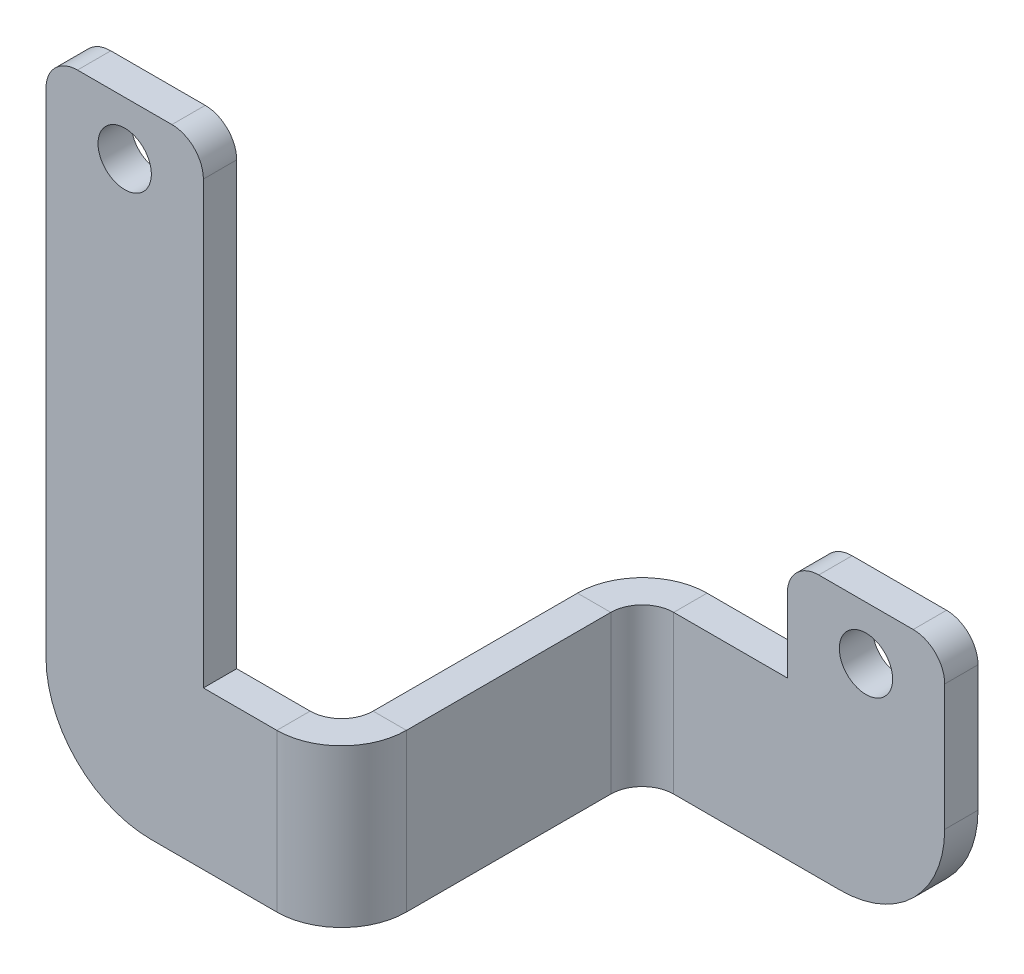
ISO-10303-21;
HEADER;
FILE_DESCRIPTION(('STEP AP214'),'2;1');
FILE_NAME('part.step','',(''),(''),'','','');
FILE_SCHEMA(('AUTOMOTIVE_DESIGN { 1 0 10303 214 1 1 1 1 }'));
ENDSEC;
DATA;
#1=APPLICATION_CONTEXT('core data for automotive mechanical design processes');
#2=APPLICATION_PROTOCOL_DEFINITION('international standard','automotive_design',2000,#1);
#3=PRODUCT_CONTEXT('',#1,'mechanical');
#4=PRODUCT('Part','Part','',(#3));
#5=PRODUCT_RELATED_PRODUCT_CATEGORY('part','',(#4));
#6=PRODUCT_DEFINITION_FORMATION('','',#4);
#7=PRODUCT_DEFINITION_CONTEXT('part definition',#1,'design');
#8=PRODUCT_DEFINITION('design','',#6,#7);
#9=PRODUCT_DEFINITION_SHAPE('','',#8);
#10=(LENGTH_UNIT() NAMED_UNIT(*) SI_UNIT(.MILLI.,.METRE.));
#11=(NAMED_UNIT(*) PLANE_ANGLE_UNIT() SI_UNIT($,.RADIAN.));
#12=(NAMED_UNIT(*) SI_UNIT($,.STERADIAN.) SOLID_ANGLE_UNIT());
#13=UNCERTAINTY_MEASURE_WITH_UNIT(LENGTH_MEASURE(1.E-05),#10,'distance_accuracy_value','');
#14=(GEOMETRIC_REPRESENTATION_CONTEXT(3) GLOBAL_UNCERTAINTY_ASSIGNED_CONTEXT((#13)) GLOBAL_UNIT_ASSIGNED_CONTEXT((#10,
#11,#12)) REPRESENTATION_CONTEXT('',''));
#15=CARTESIAN_POINT('',(0.,0.,0.));
#16=DIRECTION('',(0.,0.,1.));
#17=DIRECTION('',(1.,0.,0.));
#18=AXIS2_PLACEMENT_3D('',#15,#16,#17);
#19=CARTESIAN_POINT('',(15.6750000000001,7.5,-31.825));
#20=DIRECTION('',(0.,1.,0.));
#21=DIRECTION('',(0.,0.,1.));
#22=AXIS2_PLACEMENT_3D('',#19,#20,#21);
#23=PLANE('',#22);
#24=DIRECTION('',(-1.,0.,0.));
#25=VECTOR('',#24,1.);
#26=CARTESIAN_POINT('',(15.6750000000001,7.5,-28.65));
#27=LINE('',#26,#25);
#28=CARTESIAN_POINT('',(29.5000000000001,7.5,-28.65));
#29=VERTEX_POINT('',#28);
#30=CARTESIAN_POINT('',(18.6750000000001,7.5,-28.65));
#31=VERTEX_POINT('',#30);
#32=EDGE_CURVE('E208',#29,#31,#27,.T.);
#33=ORIENTED_EDGE('',*,*,#32,.F.);
#34=DIRECTION('',(0.,0.,1.));
#35=VECTOR('',#34,1.);
#36=CARTESIAN_POINT('',(29.5000000000001,7.5,-31.825));
#37=LINE('',#36,#35);
#38=CARTESIAN_POINT('',(29.5000000000001,7.5,-31.825));
#39=VERTEX_POINT('',#38);
#40=EDGE_CURVE('E194',#39,#29,#37,.T.);
#41=ORIENTED_EDGE('',*,*,#40,.F.);
#42=DIRECTION('',(-1.,0.,0.));
#43=VECTOR('',#42,1.);
#44=CARTESIAN_POINT('',(15.6750000000001,7.5,-31.825));
#45=LINE('',#44,#43);
#46=CARTESIAN_POINT('',(18.6750000000001,7.5,-31.825));
#47=VERTEX_POINT('',#46);
#48=EDGE_CURVE('E206',#39,#47,#45,.T.);
#49=ORIENTED_EDGE('',*,*,#48,.T.);
#50=DIRECTION('',(0.,0.,-1.));
#51=VECTOR('',#50,1.);
#52=CARTESIAN_POINT('',(18.6750000000001,7.5,-28.65));
#53=LINE('',#52,#51);
#54=EDGE_CURVE('E402',#31,#47,#53,.T.);
#55=ORIENTED_EDGE('',*,*,#54,.F.);
#56=EDGE_LOOP('',(#33,#41,#49,#55));
#57=FACE_BOUND('',#56,.T.);
#58=ADVANCED_FACE('F43',(#57),#23,.T.);
#59=CARTESIAN_POINT('',(-12.5,7.5,-3.175));
#60=DIRECTION('',(0.,1.,0.));
#61=DIRECTION('',(0.,0.,1.));
#62=AXIS2_PLACEMENT_3D('',#59,#60,#61);
#63=PLANE('',#62);
#64=DIRECTION('',(-1.,0.,0.));
#65=VECTOR('',#64,1.);
#66=CARTESIAN_POINT('',(-12.5,7.5,-3.175));
#67=LINE('',#66,#65);
#68=CARTESIAN_POINT('',(9.50000000000002,7.5,-3.175));
#69=VERTEX_POINT('',#68);
#70=CARTESIAN_POINT('',(2.5,7.5,-3.175));
#71=VERTEX_POINT('',#70);
#72=EDGE_CURVE('E297',#69,#71,#67,.T.);
#73=ORIENTED_EDGE('',*,*,#72,.T.);
#74=DIRECTION('',(0.,0.,-1.));
#75=VECTOR('',#74,1.);
#76=CARTESIAN_POINT('',(2.5,7.5,-3.175));
#77=LINE('',#76,#75);
#78=CARTESIAN_POINT('',(2.5,7.5,0.));
#79=VERTEX_POINT('',#78);
#80=EDGE_CURVE('E390',#79,#71,#77,.T.);
#81=ORIENTED_EDGE('',*,*,#80,.F.);
#82=DIRECTION('',(-1.,0.,0.));
#83=VECTOR('',#82,1.);
#84=CARTESIAN_POINT('',(-12.5,7.5,0.));
#85=LINE('',#84,#83);
#86=CARTESIAN_POINT('',(9.50000000000002,7.5,0.));
#87=VERTEX_POINT('',#86);
#88=EDGE_CURVE('E294',#87,#79,#85,.T.);
#89=ORIENTED_EDGE('',*,*,#88,.F.);
#90=DIRECTION('',(0.,0.,1.));
#91=VECTOR('',#90,1.);
#92=CARTESIAN_POINT('',(9.50000000000002,7.5,-3.175));
#93=LINE('',#92,#91);
#94=EDGE_CURVE('E291',#69,#87,#93,.T.);
#95=ORIENTED_EDGE('',*,*,#94,.F.);
#96=EDGE_LOOP('',(#73,#81,#89,#95));
#97=FACE_BOUND('',#96,.T.);
#98=ADVANCED_FACE('F458',(#97),#63,.T.);
#99=CARTESIAN_POINT('',(15.6750000000001,7.5,-28.65));
#100=DIRECTION('',(0.,1.,0.));
#101=DIRECTION('',(0.,0.,1.));
#102=AXIS2_PLACEMENT_3D('',#99,#100,#101);
#103=PLANE('',#102);
#104=DIRECTION('',(0.,0.,-1.));
#105=VECTOR('',#104,1.);
#106=CARTESIAN_POINT('',(15.6750000000001,7.5,-28.65));
#107=LINE('',#106,#105);
#108=CARTESIAN_POINT('',(15.675,7.5,-6.17499999999998));
#109=VERTEX_POINT('',#108);
#110=CARTESIAN_POINT('',(15.6750000000001,7.5,-25.65));
#111=VERTEX_POINT('',#110);
#112=EDGE_CURVE('E264',#109,#111,#107,.T.);
#113=ORIENTED_EDGE('',*,*,#112,.T.);
#114=DIRECTION('',(-1.,0.,0.));
#115=VECTOR('',#114,1.);
#116=CARTESIAN_POINT('',(15.6750000000001,7.5,-25.65));
#117=LINE('',#116,#115);
#118=CARTESIAN_POINT('',(12.5000000000001,7.5,-25.65));
#119=VERTEX_POINT('',#118);
#120=EDGE_CURVE('E239',#111,#119,#117,.T.);
#121=ORIENTED_EDGE('',*,*,#120,.T.);
#122=DIRECTION('',(0.,0.,-1.));
#123=VECTOR('',#122,1.);
#124=CARTESIAN_POINT('',(12.5000000000001,7.5,-28.65));
#125=LINE('',#124,#123);
#126=CARTESIAN_POINT('',(12.5,7.5,-6.17499999999999));
#127=VERTEX_POINT('',#126);
#128=EDGE_CURVE('E263',#127,#119,#125,.T.);
#129=ORIENTED_EDGE('',*,*,#128,.F.);
#130=DIRECTION('',(1.,0.,0.));
#131=VECTOR('',#130,1.);
#132=CARTESIAN_POINT('',(12.5,7.5,-6.17499999999999));
#133=LINE('',#132,#131);
#134=EDGE_CURVE('E250',#127,#109,#133,.T.);
#135=ORIENTED_EDGE('',*,*,#134,.T.);
#136=EDGE_LOOP('',(#113,#121,#129,#135));
#137=FACE_BOUND('',#136,.T.);
#138=ADVANCED_FACE('F463',(#137),#103,.T.);
#139=CARTESIAN_POINT('',(15.675,0.,0.));
#140=DIRECTION('',(1.,0.,0.));
#141=DIRECTION('',(0.,0.,-1.));
#142=AXIS2_PLACEMENT_3D('',#139,#140,#141);
#143=PLANE('',#142);
#144=DIRECTION('',(0.,0.,1.));
#145=VECTOR('',#144,1.);
#146=CARTESIAN_POINT('',(15.675,-7.5,-3.17499999999999));
#147=LINE('',#146,#145);
#148=CARTESIAN_POINT('',(15.6750000000001,-7.5,-25.65));
#149=VERTEX_POINT('',#148);
#150=CARTESIAN_POINT('',(15.675,-7.5,-6.17499999999998));
#151=VERTEX_POINT('',#150);
#152=EDGE_CURVE('E267',#149,#151,#147,.T.);
#153=ORIENTED_EDGE('',*,*,#152,.F.);
#154=DIRECTION('',(0.,1.,0.));
#155=VECTOR('',#154,1.);
#156=CARTESIAN_POINT('',(15.6750000000001,7.5,-25.65));
#157=LINE('',#156,#155);
#158=EDGE_CURVE('E221',#111,#149,#157,.F.);
#159=ORIENTED_EDGE('',*,*,#158,.F.);
#160=ORIENTED_EDGE('',*,*,#112,.F.);
#161=DIRECTION('',(0.,-1.,0.));
#162=VECTOR('',#161,1.);
#163=CARTESIAN_POINT('',(15.675,0.,-6.17499999999998));
#164=LINE('',#163,#162);
#165=EDGE_CURVE('E258',#109,#151,#164,.T.);
#166=ORIENTED_EDGE('',*,*,#165,.T.);
#167=EDGE_LOOP('',(#153,#159,#160,#166));
#168=FACE_BOUND('',#167,.T.);
#169=ADVANCED_FACE('F491',(#168),#143,.T.);
#170=CARTESIAN_POINT('',(12.5,0.,0.));
#171=DIRECTION('',(1.,0.,0.));
#172=DIRECTION('',(0.,0.,-1.));
#173=AXIS2_PLACEMENT_3D('',#170,#171,#172);
#174=PLANE('',#173);
#175=DIRECTION('',(0.,1.,0.));
#176=VECTOR('',#175,1.);
#177=CARTESIAN_POINT('',(12.5000000000001,7.5,-25.65));
#178=LINE('',#177,#176);
#179=CARTESIAN_POINT('',(12.5000000000001,-7.5,-25.65));
#180=VERTEX_POINT('',#179);
#181=EDGE_CURVE('E233',#119,#180,#178,.F.);
#182=ORIENTED_EDGE('',*,*,#181,.T.);
#183=DIRECTION('',(0.,0.,1.));
#184=VECTOR('',#183,1.);
#185=CARTESIAN_POINT('',(12.5,-7.5,-3.175));
#186=LINE('',#185,#184);
#187=CARTESIAN_POINT('',(12.5,-7.5,-6.17499999999999));
#188=VERTEX_POINT('',#187);
#189=EDGE_CURVE('E268',#180,#188,#186,.T.);
#190=ORIENTED_EDGE('',*,*,#189,.T.);
#191=DIRECTION('',(0.,-1.,0.));
#192=VECTOR('',#191,1.);
#193=CARTESIAN_POINT('',(12.5,7.5,-6.17499999999999));
#194=LINE('',#193,#192);
#195=EDGE_CURVE('E252',#127,#188,#194,.T.);
#196=ORIENTED_EDGE('',*,*,#195,.F.);
#197=ORIENTED_EDGE('',*,*,#128,.T.);
#198=EDGE_LOOP('',(#182,#190,#196,#197));
#199=FACE_BOUND('',#198,.T.);
#200=ADVANCED_FACE('F494',(#199),#174,.F.);
#201=CARTESIAN_POINT('',(-12.5,-7.5,-3.175));
#202=DIRECTION('',(0.,-1.,0.));
#203=DIRECTION('',(0.,0.,-1.));
#204=AXIS2_PLACEMENT_3D('',#201,#202,#203);
#205=PLANE('',#204);
#206=DIRECTION('',(1.,0.,0.));
#207=VECTOR('',#206,1.);
#208=CARTESIAN_POINT('',(-12.5,-7.5,0.));
#209=LINE('',#208,#207);
#210=CARTESIAN_POINT('',(-2.5,-7.5,0.));
#211=VERTEX_POINT('',#210);
#212=CARTESIAN_POINT('',(9.50000000000002,-7.5,0.));
#213=VERTEX_POINT('',#212);
#214=EDGE_CURVE('E301',#211,#213,#209,.T.);
#215=ORIENTED_EDGE('',*,*,#214,.F.);
#216=DIRECTION('',(0.,0.,1.));
#217=VECTOR('',#216,1.);
#218=CARTESIAN_POINT('',(-2.5,-7.5,-3.175));
#219=LINE('',#218,#217);
#220=CARTESIAN_POINT('',(-2.5,-7.5,-3.175));
#221=VERTEX_POINT('',#220);
#222=EDGE_CURVE('E51',#211,#221,#219,.F.);
#223=ORIENTED_EDGE('',*,*,#222,.T.);
#224=DIRECTION('',(1.,0.,0.));
#225=VECTOR('',#224,1.);
#226=CARTESIAN_POINT('',(-12.5,-7.5,-3.175));
#227=LINE('',#226,#225);
#228=CARTESIAN_POINT('',(9.50000000000002,-7.5,-3.175));
#229=VERTEX_POINT('',#228);
#230=EDGE_CURVE('E304',#221,#229,#227,.T.);
#231=ORIENTED_EDGE('',*,*,#230,.T.);
#232=DIRECTION('',(0.,0.,1.));
#233=VECTOR('',#232,1.);
#234=CARTESIAN_POINT('',(9.50000000000002,-7.5,-3.175));
#235=LINE('',#234,#233);
#236=EDGE_CURVE('E280',#229,#213,#235,.T.);
#237=ORIENTED_EDGE('',*,*,#236,.T.);
#238=EDGE_LOOP('',(#215,#223,#231,#237));
#239=FACE_BOUND('',#238,.T.);
#240=ADVANCED_FACE('F448',(#239),#205,.T.);
#241=CARTESIAN_POINT('',(0.,0.,-3.175));
#242=DIRECTION('',(0.,0.,-1.));
#243=DIRECTION('',(-1.,0.,0.));
#244=AXIS2_PLACEMENT_3D('',#241,#242,#243);
#245=PLANE('',#244);
#246=CARTESIAN_POINT('',(-5.,47.42,-3.175));
#247=DIRECTION('',(0.,0.,-1.));
#248=DIRECTION('',(-1.,0.,0.));
#249=AXIS2_PLACEMENT_3D('',#246,#247,#248);
#250=CIRCLE('',#249,2.54000000000001);
#251=CARTESIAN_POINT('',(-7.54,47.42,-3.175));
#252=VERTEX_POINT('',#251);
#253=EDGE_CURVE('E201',#252,#252,#250,.T.);
#254=ORIENTED_EDGE('',*,*,#253,.F.);
#255=EDGE_LOOP('',(#254));
#256=FACE_BOUND('',#255,.T.);
#257=ORIENTED_EDGE('',*,*,#230,.F.);
#258=CARTESIAN_POINT('',(-2.5,2.5,-3.175));
#259=DIRECTION('',(0.,0.,-1.));
#260=DIRECTION('',(-1.,0.,0.));
#261=AXIS2_PLACEMENT_3D('',#258,#259,#260);
#262=CIRCLE('',#261,10.);
#263=CARTESIAN_POINT('',(-12.5,2.5,-3.175));
#264=VERTEX_POINT('',#263);
#265=EDGE_CURVE('E11',#221,#264,#262,.T.);
#266=ORIENTED_EDGE('',*,*,#265,.T.);
#267=DIRECTION('',(0.,-1.,0.));
#268=VECTOR('',#267,1.);
#269=CARTESIAN_POINT('',(-12.5,-7.5,-3.175));
#270=LINE('',#269,#268);
#271=CARTESIAN_POINT('',(-12.5,49.5,-3.175));
#272=VERTEX_POINT('',#271);
#273=EDGE_CURVE('E300',#272,#264,#270,.T.);
#274=ORIENTED_EDGE('',*,*,#273,.F.);
#275=CARTESIAN_POINT('',(-9.49999999999999,49.5,-3.175));
#276=DIRECTION('',(0.,0.,-1.));
#277=DIRECTION('',(-1.,0.,0.));
#278=AXIS2_PLACEMENT_3D('',#275,#276,#277);
#279=CIRCLE('',#278,3.);
#280=CARTESIAN_POINT('',(-9.49999999999999,52.5,-3.175));
#281=VERTEX_POINT('',#280);
#282=EDGE_CURVE('E339',#272,#281,#279,.T.);
#283=ORIENTED_EDGE('',*,*,#282,.T.);
#284=DIRECTION('',(-1.,0.,0.));
#285=VECTOR('',#284,1.);
#286=CARTESIAN_POINT('',(-12.5,52.5,-3.175));
#287=LINE('',#286,#285);
#288=CARTESIAN_POINT('',(-0.499999999999995,52.5,-3.175));
#289=VERTEX_POINT('',#288);
#290=EDGE_CURVE('E384',#289,#281,#287,.T.);
#291=ORIENTED_EDGE('',*,*,#290,.F.);
#292=CARTESIAN_POINT('',(-0.499999999999996,49.5,-3.175));
#293=DIRECTION('',(0.,0.,-1.));
#294=DIRECTION('',(-1.,0.,0.));
#295=AXIS2_PLACEMENT_3D('',#292,#293,#294);
#296=CIRCLE('',#295,3.);
#297=CARTESIAN_POINT('',(2.5,49.5,-3.175));
#298=VERTEX_POINT('',#297);
#299=EDGE_CURVE('E341',#289,#298,#296,.T.);
#300=ORIENTED_EDGE('',*,*,#299,.T.);
#301=DIRECTION('',(0.,-1.,0.));
#302=VECTOR('',#301,1.);
#303=CARTESIAN_POINT('',(2.5,52.5,-3.175));
#304=LINE('',#303,#302);
#305=EDGE_CURVE('E386',#298,#71,#304,.T.);
#306=ORIENTED_EDGE('',*,*,#305,.T.);
#307=ORIENTED_EDGE('',*,*,#72,.F.);
#308=DIRECTION('',(0.,-1.,0.));
#309=VECTOR('',#308,1.);
#310=CARTESIAN_POINT('',(9.50000000000002,-7.5,-3.175));
#311=LINE('',#310,#309);
#312=EDGE_CURVE('E286',#229,#69,#311,.F.);
#313=ORIENTED_EDGE('',*,*,#312,.F.);
#314=EDGE_LOOP('',(#257,#266,#274,#283,#291,#300,#306,#307,#313));
#315=FACE_BOUND('',#314,.T.);
#316=ADVANCED_FACE('F446',(#256,#315),#245,.T.);
#317=CARTESIAN_POINT('',(0.,0.,0.));
#318=DIRECTION('',(0.,0.,-1.));
#319=DIRECTION('',(-1.,0.,0.));
#320=AXIS2_PLACEMENT_3D('',#317,#318,#319);
#321=PLANE('',#320);
#322=CARTESIAN_POINT('',(-5.,47.42,0.));
#323=DIRECTION('',(0.,0.,-1.));
#324=DIRECTION('',(-1.,0.,0.));
#325=AXIS2_PLACEMENT_3D('',#322,#323,#324);
#326=CIRCLE('',#325,2.54000000000001);
#327=CARTESIAN_POINT('',(-7.54,47.42,0.));
#328=VERTEX_POINT('',#327);
#329=EDGE_CURVE('E395',#328,#328,#326,.T.);
#330=ORIENTED_EDGE('',*,*,#329,.T.);
#331=EDGE_LOOP('',(#330));
#332=FACE_BOUND('',#331,.T.);
#333=DIRECTION('',(0.,-1.,0.));
#334=VECTOR('',#333,1.);
#335=CARTESIAN_POINT('',(-12.5,-7.5,0.));
#336=LINE('',#335,#334);
#337=CARTESIAN_POINT('',(-12.5,49.5,0.));
#338=VERTEX_POINT('',#337);
#339=CARTESIAN_POINT('',(-12.5,2.5,0.));
#340=VERTEX_POINT('',#339);
#341=EDGE_CURVE('E309',#338,#340,#336,.T.);
#342=ORIENTED_EDGE('',*,*,#341,.T.);
#343=CARTESIAN_POINT('',(-2.5,2.5,0.));
#344=DIRECTION('',(0.,0.,-1.));
#345=DIRECTION('',(-1.,0.,0.));
#346=AXIS2_PLACEMENT_3D('',#343,#344,#345);
#347=CIRCLE('',#346,10.);
#348=EDGE_CURVE('E65',#340,#211,#347,.F.);
#349=ORIENTED_EDGE('',*,*,#348,.T.);
#350=ORIENTED_EDGE('',*,*,#214,.T.);
#351=DIRECTION('',(0.,-1.,0.));
#352=VECTOR('',#351,1.);
#353=CARTESIAN_POINT('',(9.50000000000002,-7.5,0.));
#354=LINE('',#353,#352);
#355=EDGE_CURVE('E274',#213,#87,#354,.F.);
#356=ORIENTED_EDGE('',*,*,#355,.T.);
#357=ORIENTED_EDGE('',*,*,#88,.T.);
#358=DIRECTION('',(0.,-1.,0.));
#359=VECTOR('',#358,1.);
#360=CARTESIAN_POINT('',(2.5,52.5,0.));
#361=LINE('',#360,#359);
#362=CARTESIAN_POINT('',(2.5,49.5,0.));
#363=VERTEX_POINT('',#362);
#364=EDGE_CURVE('E388',#363,#79,#361,.T.);
#365=ORIENTED_EDGE('',*,*,#364,.F.);
#366=CARTESIAN_POINT('',(-0.499999999999996,49.5,0.));
#367=DIRECTION('',(0.,0.,-1.));
#368=DIRECTION('',(-1.,0.,0.));
#369=AXIS2_PLACEMENT_3D('',#366,#367,#368);
#370=CIRCLE('',#369,3.);
#371=CARTESIAN_POINT('',(-0.499999999999999,52.5,0.));
#372=VERTEX_POINT('',#371);
#373=EDGE_CURVE('E347',#363,#372,#370,.F.);
#374=ORIENTED_EDGE('',*,*,#373,.T.);
#375=DIRECTION('',(1.,0.,0.));
#376=VECTOR('',#375,1.);
#377=CARTESIAN_POINT('',(-12.5,52.5,0.));
#378=LINE('',#377,#376);
#379=CARTESIAN_POINT('',(-9.49999999999999,52.5,0.));
#380=VERTEX_POINT('',#379);
#381=EDGE_CURVE('E374',#380,#372,#378,.T.);
#382=ORIENTED_EDGE('',*,*,#381,.F.);
#383=CARTESIAN_POINT('',(-9.49999999999999,49.5,0.));
#384=DIRECTION('',(0.,0.,-1.));
#385=DIRECTION('',(-1.,0.,0.));
#386=AXIS2_PLACEMENT_3D('',#383,#384,#385);
#387=CIRCLE('',#386,3.);
#388=EDGE_CURVE('E345',#380,#338,#387,.F.);
#389=ORIENTED_EDGE('',*,*,#388,.T.);
#390=EDGE_LOOP('',(#342,#349,#350,#356,#357,#365,#374,#382,#389));
#391=FACE_BOUND('',#390,.T.);
#392=ADVANCED_FACE('F371',(#332,#391),#321,.F.);
#393=CARTESIAN_POINT('',(-12.5,-7.5,-3.175));
#394=DIRECTION('',(-1.,0.,0.));
#395=DIRECTION('',(0.,0.,1.));
#396=AXIS2_PLACEMENT_3D('',#393,#394,#395);
#397=PLANE('',#396);
#398=ORIENTED_EDGE('',*,*,#273,.T.);
#399=DIRECTION('',(0.,0.,1.));
#400=VECTOR('',#399,1.);
#401=CARTESIAN_POINT('',(-12.5,2.5,-3.175));
#402=LINE('',#401,#400);
#403=EDGE_CURVE('E360',#264,#340,#402,.T.);
#404=ORIENTED_EDGE('',*,*,#403,.T.);
#405=ORIENTED_EDGE('',*,*,#341,.F.);
#406=DIRECTION('',(0.,0.,1.));
#407=VECTOR('',#406,1.);
#408=CARTESIAN_POINT('',(-12.5,49.5,-3.175));
#409=LINE('',#408,#407);
#410=EDGE_CURVE('E349',#338,#272,#409,.F.);
#411=ORIENTED_EDGE('',*,*,#410,.T.);
#412=EDGE_LOOP('',(#398,#404,#405,#411));
#413=FACE_BOUND('',#412,.T.);
#414=ADVANCED_FACE('F366',(#413),#397,.T.);
#415=CARTESIAN_POINT('',(9.50000000000002,7.5,-6.175));
#416=DIRECTION('',(0.,1.,0.));
#417=DIRECTION('',(0.,0.,1.));
#418=AXIS2_PLACEMENT_3D('',#415,#416,#417);
#419=PLANE('',#418);
#420=ORIENTED_EDGE('',*,*,#134,.F.);
#421=CARTESIAN_POINT('',(9.50000000000002,7.5,-6.175));
#422=DIRECTION('',(0.,-1.,0.));
#423=DIRECTION('',(0.,0.,-1.));
#424=AXIS2_PLACEMENT_3D('',#421,#422,#423);
#425=CIRCLE('',#424,3.);
#426=EDGE_CURVE('E283',#69,#127,#425,.F.);
#427=ORIENTED_EDGE('',*,*,#426,.F.);
#428=ORIENTED_EDGE('',*,*,#94,.T.);
#429=CARTESIAN_POINT('',(9.50000000000002,7.5,-6.175));
#430=DIRECTION('',(0.,-1.,0.));
#431=DIRECTION('',(0.,0.,-1.));
#432=AXIS2_PLACEMENT_3D('',#429,#430,#431);
#433=CIRCLE('',#432,6.175);
#434=EDGE_CURVE('E276',#87,#109,#433,.F.);
#435=ORIENTED_EDGE('',*,*,#434,.T.);
#436=EDGE_LOOP('',(#420,#427,#428,#435));
#437=FACE_BOUND('',#436,.T.);
#438=ADVANCED_FACE('F514',(#437),#419,.T.);
#439=CARTESIAN_POINT('',(9.50000000000002,-7.5,-6.175));
#440=DIRECTION('',(0.,1.,0.));
#441=DIRECTION('',(0.,0.,1.));
#442=AXIS2_PLACEMENT_3D('',#439,#440,#441);
#443=PLANE('',#442);
#444=CARTESIAN_POINT('',(9.50000000000002,-7.5,-6.175));
#445=DIRECTION('',(0.,-1.,0.));
#446=DIRECTION('',(0.,0.,-1.));
#447=AXIS2_PLACEMENT_3D('',#444,#445,#446);
#448=CIRCLE('',#447,3.);
#449=EDGE_CURVE('E270',#188,#229,#448,.T.);
#450=ORIENTED_EDGE('',*,*,#449,.F.);
#451=DIRECTION('',(1.,0.,0.));
#452=VECTOR('',#451,1.);
#453=CARTESIAN_POINT('',(12.5,-7.5,-6.17499999999999));
#454=LINE('',#453,#452);
#455=EDGE_CURVE('E255',#188,#151,#454,.T.);
#456=ORIENTED_EDGE('',*,*,#455,.T.);
#457=CARTESIAN_POINT('',(9.50000000000002,-7.5,-6.175));
#458=DIRECTION('',(0.,-1.,0.));
#459=DIRECTION('',(0.,0.,-1.));
#460=AXIS2_PLACEMENT_3D('',#457,#458,#459);
#461=CIRCLE('',#460,6.175);
#462=EDGE_CURVE('E277',#151,#213,#461,.T.);
#463=ORIENTED_EDGE('',*,*,#462,.T.);
#464=ORIENTED_EDGE('',*,*,#236,.F.);
#465=EDGE_LOOP('',(#450,#456,#463,#464));
#466=FACE_BOUND('',#465,.T.);
#467=ADVANCED_FACE('F509',(#466),#443,.F.);
#468=CARTESIAN_POINT('',(9.50000000000002,-7.5,-6.175));
#469=DIRECTION('',(0.,-1.,0.));
#470=DIRECTION('',(1.,0.,0.));
#471=AXIS2_PLACEMENT_3D('',#468,#469,#470);
#472=CYLINDRICAL_SURFACE('',#471,6.175);
#473=ORIENTED_EDGE('',*,*,#355,.F.);
#474=ORIENTED_EDGE('',*,*,#462,.F.);
#475=ORIENTED_EDGE('',*,*,#165,.F.);
#476=ORIENTED_EDGE('',*,*,#434,.F.);
#477=EDGE_LOOP('',(#473,#474,#475,#476));
#478=FACE_BOUND('',#477,.T.);
#479=ADVANCED_FACE('F506',(#478),#472,.T.);
#480=CARTESIAN_POINT('',(9.50000000000002,-7.5,-6.175));
#481=DIRECTION('',(0.,-1.,0.));
#482=DIRECTION('',(1.,0.,0.));
#483=AXIS2_PLACEMENT_3D('',#480,#481,#482);
#484=CYLINDRICAL_SURFACE('',#483,3.);
#485=ORIENTED_EDGE('',*,*,#312,.T.);
#486=ORIENTED_EDGE('',*,*,#426,.T.);
#487=ORIENTED_EDGE('',*,*,#195,.T.);
#488=ORIENTED_EDGE('',*,*,#449,.T.);
#489=EDGE_LOOP('',(#485,#486,#487,#488));
#490=FACE_BOUND('',#489,.T.);
#491=ADVANCED_FACE('F501',(#490),#484,.F.);
#492=CARTESIAN_POINT('',(15.675,-7.5,-3.17499999999999));
#493=DIRECTION('',(0.,-1.,0.));
#494=DIRECTION('',(0.,0.,-1.));
#495=AXIS2_PLACEMENT_3D('',#492,#493,#494);
#496=PLANE('',#495);
#497=DIRECTION('',(-1.,0.,0.));
#498=VECTOR('',#497,1.);
#499=CARTESIAN_POINT('',(15.6750000000001,-7.5,-25.65));
#500=LINE('',#499,#498);
#501=EDGE_CURVE('E247',#149,#180,#500,.T.);
#502=ORIENTED_EDGE('',*,*,#501,.F.);
#503=ORIENTED_EDGE('',*,*,#152,.T.);
#504=ORIENTED_EDGE('',*,*,#455,.F.);
#505=ORIENTED_EDGE('',*,*,#189,.F.);
#506=EDGE_LOOP('',(#502,#503,#504,#505));
#507=FACE_BOUND('',#506,.T.);
#508=ADVANCED_FACE('F486',(#507),#496,.T.);
#509=CARTESIAN_POINT('',(18.6750000000001,-7.5,-25.65));
#510=DIRECTION('',(0.,-1.,0.));
#511=DIRECTION('',(0.,0.,-1.));
#512=AXIS2_PLACEMENT_3D('',#509,#510,#511);
#513=PLANE('',#512);
#514=DIRECTION('',(0.,0.,-1.));
#515=VECTOR('',#514,1.);
#516=CARTESIAN_POINT('',(18.6750000000001,-7.5,-28.65));
#517=LINE('',#516,#515);
#518=CARTESIAN_POINT('',(18.6750000000001,-7.5,-28.65));
#519=VERTEX_POINT('',#518);
#520=CARTESIAN_POINT('',(18.6750000000001,-7.5,-31.825));
#521=VERTEX_POINT('',#520);
#522=EDGE_CURVE('E398',#519,#521,#517,.T.);
#523=ORIENTED_EDGE('',*,*,#522,.F.);
#524=CARTESIAN_POINT('',(18.6750000000001,-7.5,-25.65));
#525=DIRECTION('',(0.,1.,0.));
#526=DIRECTION('',(0.,0.,1.));
#527=AXIS2_PLACEMENT_3D('',#524,#525,#526);
#528=CIRCLE('',#527,3.);
#529=EDGE_CURVE('E242',#149,#519,#528,.F.);
#530=ORIENTED_EDGE('',*,*,#529,.F.);
#531=ORIENTED_EDGE('',*,*,#501,.T.);
#532=CARTESIAN_POINT('',(18.6750000000001,-7.5,-25.65));
#533=DIRECTION('',(0.,1.,0.));
#534=DIRECTION('',(0.,0.,1.));
#535=AXIS2_PLACEMENT_3D('',#532,#533,#534);
#536=CIRCLE('',#535,6.175);
#537=EDGE_CURVE('E235',#180,#521,#536,.F.);
#538=ORIENTED_EDGE('',*,*,#537,.T.);
#539=EDGE_LOOP('',(#523,#530,#531,#538));
#540=FACE_BOUND('',#539,.T.);
#541=ADVANCED_FACE('F483',(#540),#513,.T.);
#542=CARTESIAN_POINT('',(18.6750000000001,7.5,-25.65));
#543=DIRECTION('',(0.,-1.,0.));
#544=DIRECTION('',(0.,0.,-1.));
#545=AXIS2_PLACEMENT_3D('',#542,#543,#544);
#546=PLANE('',#545);
#547=CARTESIAN_POINT('',(18.6750000000001,7.5,-25.65));
#548=DIRECTION('',(0.,1.,0.));
#549=DIRECTION('',(0.,0.,1.));
#550=AXIS2_PLACEMENT_3D('',#547,#548,#549);
#551=CIRCLE('',#550,3.);
#552=EDGE_CURVE('E217',#31,#111,#551,.T.);
#553=ORIENTED_EDGE('',*,*,#552,.F.);
#554=ORIENTED_EDGE('',*,*,#54,.T.);
#555=CARTESIAN_POINT('',(18.6750000000001,7.5,-25.65));
#556=DIRECTION('',(0.,1.,0.));
#557=DIRECTION('',(0.,0.,1.));
#558=AXIS2_PLACEMENT_3D('',#555,#556,#557);
#559=CIRCLE('',#558,6.175);
#560=EDGE_CURVE('E236',#47,#119,#559,.T.);
#561=ORIENTED_EDGE('',*,*,#560,.T.);
#562=ORIENTED_EDGE('',*,*,#120,.F.);
#563=EDGE_LOOP('',(#553,#554,#561,#562));
#564=FACE_BOUND('',#563,.T.);
#565=ADVANCED_FACE('F478',(#564),#546,.F.);
#566=CARTESIAN_POINT('',(18.6750000000001,7.5,-25.65));
#567=DIRECTION('',(0.,1.,0.));
#568=DIRECTION('',(0.,0.,-1.));
#569=AXIS2_PLACEMENT_3D('',#566,#567,#568);
#570=CYLINDRICAL_SURFACE('',#569,6.175);
#571=ORIENTED_EDGE('',*,*,#181,.F.);
#572=ORIENTED_EDGE('',*,*,#560,.F.);
#573=DIRECTION('',(0.,1.,0.));
#574=VECTOR('',#573,1.);
#575=CARTESIAN_POINT('',(18.6750000000001,0.,-31.825));
#576=LINE('',#575,#574);
#577=EDGE_CURVE('E216',#521,#47,#576,.T.);
#578=ORIENTED_EDGE('',*,*,#577,.F.);
#579=ORIENTED_EDGE('',*,*,#537,.F.);
#580=EDGE_LOOP('',(#571,#572,#578,#579));
#581=FACE_BOUND('',#580,.T.);
#582=ADVANCED_FACE('F475',(#581),#570,.T.);
#583=CARTESIAN_POINT('',(18.6750000000001,7.5,-25.65));
#584=DIRECTION('',(0.,1.,0.));
#585=DIRECTION('',(0.,0.,-1.));
#586=AXIS2_PLACEMENT_3D('',#583,#584,#585);
#587=CYLINDRICAL_SURFACE('',#586,3.);
#588=ORIENTED_EDGE('',*,*,#158,.T.);
#589=ORIENTED_EDGE('',*,*,#529,.T.);
#590=DIRECTION('',(0.,1.,0.));
#591=VECTOR('',#590,1.);
#592=CARTESIAN_POINT('',(18.6750000000001,-7.5,-28.65));
#593=LINE('',#592,#591);
#594=EDGE_CURVE('E399',#519,#31,#593,.T.);
#595=ORIENTED_EDGE('',*,*,#594,.T.);
#596=ORIENTED_EDGE('',*,*,#552,.T.);
#597=EDGE_LOOP('',(#588,#589,#595,#596));
#598=FACE_BOUND('',#597,.T.);
#599=ADVANCED_FACE('F474',(#598),#587,.F.);
#600=CARTESIAN_POINT('',(44.5000000000001,-7.5,-31.825));
#601=DIRECTION('',(0.,-1.,0.));
#602=DIRECTION('',(1.,0.,0.));
#603=AXIS2_PLACEMENT_3D('',#600,#601,#602);
#604=PLANE('',#603);
#605=DIRECTION('',(1.,0.,0.));
#606=VECTOR('',#605,1.);
#607=CARTESIAN_POINT('',(44.5000000000001,-7.5,-31.825));
#608=LINE('',#607,#606);
#609=CARTESIAN_POINT('',(34.5000000000001,-7.5,-31.825));
#610=VERTEX_POINT('',#609);
#611=EDGE_CURVE('E223',#521,#610,#608,.T.);
#612=ORIENTED_EDGE('',*,*,#611,.T.);
#613=DIRECTION('',(0.,0.,1.));
#614=VECTOR('',#613,1.);
#615=CARTESIAN_POINT('',(34.5000000000001,-7.5,-31.825));
#616=LINE('',#615,#614);
#617=CARTESIAN_POINT('',(34.5000000000001,-7.5,-28.65));
#618=VERTEX_POINT('',#617);
#619=EDGE_CURVE('E351',#610,#618,#616,.T.);
#620=ORIENTED_EDGE('',*,*,#619,.T.);
#621=DIRECTION('',(1.,0.,0.));
#622=VECTOR('',#621,1.);
#623=CARTESIAN_POINT('',(44.5000000000001,-7.5,-28.65));
#624=LINE('',#623,#622);
#625=EDGE_CURVE('E227',#519,#618,#624,.T.);
#626=ORIENTED_EDGE('',*,*,#625,.F.);
#627=ORIENTED_EDGE('',*,*,#522,.T.);
#628=EDGE_LOOP('',(#612,#620,#626,#627));
#629=FACE_BOUND('',#628,.T.);
#630=ADVANCED_FACE('F410',(#629),#604,.T.);
#631=CARTESIAN_POINT('',(0.,0.,-31.825));
#632=DIRECTION('',(0.,0.,-1.));
#633=DIRECTION('',(-1.,0.,0.));
#634=AXIS2_PLACEMENT_3D('',#631,#632,#633);
#635=PLANE('',#634);
#636=CARTESIAN_POINT('',(37.0000000000001,12.42,-31.825));
#637=DIRECTION('',(0.,0.,-1.));
#638=DIRECTION('',(-1.,0.,0.));
#639=AXIS2_PLACEMENT_3D('',#636,#637,#638);
#640=CIRCLE('',#639,2.54);
#641=CARTESIAN_POINT('',(34.4600000000001,12.42,-31.825));
#642=VERTEX_POINT('',#641);
#643=EDGE_CURVE('E314',#642,#642,#640,.T.);
#644=ORIENTED_EDGE('',*,*,#643,.F.);
#645=EDGE_LOOP('',(#644));
#646=FACE_BOUND('',#645,.T.);
#647=DIRECTION('',(0.,1.,0.));
#648=VECTOR('',#647,1.);
#649=CARTESIAN_POINT('',(44.5000000000001,7.5,-31.825));
#650=LINE('',#649,#648);
#651=CARTESIAN_POINT('',(44.5000000000001,2.5,-31.825));
#652=VERTEX_POINT('',#651);
#653=CARTESIAN_POINT('',(44.5000000000001,14.5,-31.825));
#654=VERTEX_POINT('',#653);
#655=EDGE_CURVE('E218',#652,#654,#650,.T.);
#656=ORIENTED_EDGE('',*,*,#655,.F.);
#657=CARTESIAN_POINT('',(34.5000000000001,2.5,-31.825));
#658=DIRECTION('',(0.,0.,-1.));
#659=DIRECTION('',(-1.,0.,0.));
#660=AXIS2_PLACEMENT_3D('',#657,#658,#659);
#661=CIRCLE('',#660,10.);
#662=EDGE_CURVE('E358',#652,#610,#661,.T.);
#663=ORIENTED_EDGE('',*,*,#662,.T.);
#664=ORIENTED_EDGE('',*,*,#611,.F.);
#665=ORIENTED_EDGE('',*,*,#577,.T.);
#666=ORIENTED_EDGE('',*,*,#48,.F.);
#667=DIRECTION('',(0.,-1.,0.));
#668=VECTOR('',#667,1.);
#669=CARTESIAN_POINT('',(29.5000000000001,17.5,-31.825));
#670=LINE('',#669,#668);
#671=CARTESIAN_POINT('',(29.5000000000001,14.5,-31.825));
#672=VERTEX_POINT('',#671);
#673=EDGE_CURVE('E190',#672,#39,#670,.T.);
#674=ORIENTED_EDGE('',*,*,#673,.F.);
#675=CARTESIAN_POINT('',(32.5000000000001,14.5,-31.825));
#676=DIRECTION('',(0.,0.,-1.));
#677=DIRECTION('',(-1.,0.,0.));
#678=AXIS2_PLACEMENT_3D('',#675,#676,#677);
#679=CIRCLE('',#678,3.);
#680=CARTESIAN_POINT('',(32.5000000000001,17.5,-31.825));
#681=VERTEX_POINT('',#680);
#682=EDGE_CURVE('E328',#672,#681,#679,.T.);
#683=ORIENTED_EDGE('',*,*,#682,.T.);
#684=DIRECTION('',(-1.,0.,0.));
#685=VECTOR('',#684,1.);
#686=CARTESIAN_POINT('',(44.5000000000001,17.5,-31.825));
#687=LINE('',#686,#685);
#688=CARTESIAN_POINT('',(41.5000000000001,17.5,-31.825));
#689=VERTEX_POINT('',#688);
#690=EDGE_CURVE('E209',#689,#681,#687,.T.);
#691=ORIENTED_EDGE('',*,*,#690,.F.);
#692=CARTESIAN_POINT('',(41.5000000000001,14.5,-31.825));
#693=DIRECTION('',(0.,0.,-1.));
#694=DIRECTION('',(-1.,0.,0.));
#695=AXIS2_PLACEMENT_3D('',#692,#693,#694);
#696=CIRCLE('',#695,3.);
#697=EDGE_CURVE('E325',#689,#654,#696,.T.);
#698=ORIENTED_EDGE('',*,*,#697,.T.);
#699=EDGE_LOOP('',(#656,#663,#664,#665,#666,#674,#683,#691,#698));
#700=FACE_BOUND('',#699,.T.);
#701=ADVANCED_FACE('F214',(#646,#700),#635,.T.);
#702=CARTESIAN_POINT('',(0.,0.,-28.65));
#703=DIRECTION('',(0.,0.,-1.));
#704=DIRECTION('',(-1.,0.,0.));
#705=AXIS2_PLACEMENT_3D('',#702,#703,#704);
#706=PLANE('',#705);
#707=CARTESIAN_POINT('',(37.0000000000001,12.42,-28.65));
#708=DIRECTION('',(0.,0.,-1.));
#709=DIRECTION('',(-1.,0.,0.));
#710=AXIS2_PLACEMENT_3D('',#707,#708,#709);
#711=CIRCLE('',#710,2.54);
#712=CARTESIAN_POINT('',(34.4600000000001,12.42,-28.65));
#713=VERTEX_POINT('',#712);
#714=EDGE_CURVE('E210',#713,#713,#711,.T.);
#715=ORIENTED_EDGE('',*,*,#714,.T.);
#716=EDGE_LOOP('',(#715));
#717=FACE_BOUND('',#716,.T.);
#718=ORIENTED_EDGE('',*,*,#625,.T.);
#719=CARTESIAN_POINT('',(34.5000000000001,2.5,-28.65));
#720=DIRECTION('',(0.,0.,-1.));
#721=DIRECTION('',(-1.,0.,0.));
#722=AXIS2_PLACEMENT_3D('',#719,#720,#721);
#723=CIRCLE('',#722,10.);
#724=CARTESIAN_POINT('',(44.5000000000001,2.5,-28.65));
#725=VERTEX_POINT('',#724);
#726=EDGE_CURVE('E354',#618,#725,#723,.F.);
#727=ORIENTED_EDGE('',*,*,#726,.T.);
#728=DIRECTION('',(0.,1.,0.));
#729=VECTOR('',#728,1.);
#730=CARTESIAN_POINT('',(44.5000000000001,7.5,-28.65));
#731=LINE('',#730,#729);
#732=CARTESIAN_POINT('',(44.5000000000001,14.5,-28.65));
#733=VERTEX_POINT('',#732);
#734=EDGE_CURVE('E230',#725,#733,#731,.T.);
#735=ORIENTED_EDGE('',*,*,#734,.T.);
#736=CARTESIAN_POINT('',(41.5000000000001,14.5,-28.65));
#737=DIRECTION('',(0.,0.,-1.));
#738=DIRECTION('',(-1.,0.,0.));
#739=AXIS2_PLACEMENT_3D('',#736,#737,#738);
#740=CIRCLE('',#739,3.);
#741=CARTESIAN_POINT('',(41.5000000000001,17.5,-28.65));
#742=VERTEX_POINT('',#741);
#743=EDGE_CURVE('E320',#733,#742,#740,.F.);
#744=ORIENTED_EDGE('',*,*,#743,.T.);
#745=DIRECTION('',(1.,0.,0.));
#746=VECTOR('',#745,1.);
#747=CARTESIAN_POINT('',(44.5000000000001,17.5,-28.65));
#748=LINE('',#747,#746);
#749=CARTESIAN_POINT('',(32.5000000000001,17.5,-28.65));
#750=VERTEX_POINT('',#749);
#751=EDGE_CURVE('E429',#750,#742,#748,.T.);
#752=ORIENTED_EDGE('',*,*,#751,.F.);
#753=CARTESIAN_POINT('',(32.5000000000001,14.5,-28.65));
#754=DIRECTION('',(0.,0.,-1.));
#755=DIRECTION('',(-1.,0.,0.));
#756=AXIS2_PLACEMENT_3D('',#753,#754,#755);
#757=CIRCLE('',#756,3.);
#758=CARTESIAN_POINT('',(29.5000000000001,14.5,-28.65));
#759=VERTEX_POINT('',#758);
#760=EDGE_CURVE('E322',#750,#759,#757,.F.);
#761=ORIENTED_EDGE('',*,*,#760,.T.);
#762=DIRECTION('',(0.,-1.,0.));
#763=VECTOR('',#762,1.);
#764=CARTESIAN_POINT('',(29.5000000000001,17.5,-28.65));
#765=LINE('',#764,#763);
#766=EDGE_CURVE('E202',#759,#29,#765,.T.);
#767=ORIENTED_EDGE('',*,*,#766,.T.);
#768=ORIENTED_EDGE('',*,*,#32,.T.);
#769=ORIENTED_EDGE('',*,*,#594,.F.);
#770=EDGE_LOOP('',(#718,#727,#735,#744,#752,#761,#767,#768,#769));
#771=FACE_BOUND('',#770,.T.);
#772=ADVANCED_FACE('F418',(#717,#771),#706,.F.);
#773=CARTESIAN_POINT('',(44.5000000000001,7.5,-31.825));
#774=DIRECTION('',(1.,0.,0.));
#775=DIRECTION('',(0.,0.,-1.));
#776=AXIS2_PLACEMENT_3D('',#773,#774,#775);
#777=PLANE('',#776);
#778=ORIENTED_EDGE('',*,*,#734,.F.);
#779=DIRECTION('',(0.,0.,1.));
#780=VECTOR('',#779,1.);
#781=CARTESIAN_POINT('',(44.5000000000001,2.5,-31.825));
#782=LINE('',#781,#780);
#783=EDGE_CURVE('E356',#725,#652,#782,.F.);
#784=ORIENTED_EDGE('',*,*,#783,.T.);
#785=ORIENTED_EDGE('',*,*,#655,.T.);
#786=DIRECTION('',(0.,0.,-1.));
#787=VECTOR('',#786,1.);
#788=CARTESIAN_POINT('',(44.5000000000001,14.5,-28.65));
#789=LINE('',#788,#787);
#790=EDGE_CURVE('E330',#654,#733,#789,.F.);
#791=ORIENTED_EDGE('',*,*,#790,.T.);
#792=EDGE_LOOP('',(#778,#784,#785,#791));
#793=FACE_BOUND('',#792,.T.);
#794=ADVANCED_FACE('F421',(#793),#777,.T.);
#795=CARTESIAN_POINT('',(2.5,52.5,-3.175));
#796=DIRECTION('',(-1.,0.,0.));
#797=DIRECTION('',(0.,0.,1.));
#798=AXIS2_PLACEMENT_3D('',#795,#796,#797);
#799=PLANE('',#798);
#800=ORIENTED_EDGE('',*,*,#305,.F.);
#801=DIRECTION('',(0.,0.,-1.));
#802=VECTOR('',#801,1.);
#803=CARTESIAN_POINT('',(2.5,49.5,0.));
#804=LINE('',#803,#802);
#805=EDGE_CURVE('E343',#298,#363,#804,.F.);
#806=ORIENTED_EDGE('',*,*,#805,.T.);
#807=ORIENTED_EDGE('',*,*,#364,.T.);
#808=ORIENTED_EDGE('',*,*,#80,.T.);
#809=EDGE_LOOP('',(#800,#806,#807,#808));
#810=FACE_BOUND('',#809,.T.);
#811=ADVANCED_FACE('F471',(#810),#799,.F.);
#812=CARTESIAN_POINT('',(0.,52.5,0.));
#813=DIRECTION('',(0.,1.,0.));
#814=DIRECTION('',(0.,0.,1.));
#815=AXIS2_PLACEMENT_3D('',#812,#813,#814);
#816=PLANE('',#815);
#817=ORIENTED_EDGE('',*,*,#381,.T.);
#818=DIRECTION('',(0.,0.,-1.));
#819=VECTOR('',#818,1.);
#820=CARTESIAN_POINT('',(-0.499999999999996,52.5,-3.175));
#821=LINE('',#820,#819);
#822=EDGE_CURVE('E336',#372,#289,#821,.T.);
#823=ORIENTED_EDGE('',*,*,#822,.T.);
#824=ORIENTED_EDGE('',*,*,#290,.T.);
#825=DIRECTION('',(0.,0.,1.));
#826=VECTOR('',#825,1.);
#827=CARTESIAN_POINT('',(-9.49999999999999,52.5,0.));
#828=LINE('',#827,#826);
#829=EDGE_CURVE('E333',#281,#380,#828,.T.);
#830=ORIENTED_EDGE('',*,*,#829,.T.);
#831=EDGE_LOOP('',(#817,#823,#824,#830));
#832=FACE_BOUND('',#831,.T.);
#833=ADVANCED_FACE('F381',(#832),#816,.T.);
#834=CARTESIAN_POINT('',(-5.,47.42,0.));
#835=DIRECTION('',(0.,0.,-1.));
#836=DIRECTION('',(-1.,0.,0.));
#837=AXIS2_PLACEMENT_3D('',#834,#835,#836);
#838=CYLINDRICAL_SURFACE('',#837,2.54000000000001);
#839=ORIENTED_EDGE('',*,*,#329,.F.);
#840=EDGE_LOOP('',(#839));
#841=FACE_BOUND('',#840,.T.);
#842=ORIENTED_EDGE('',*,*,#253,.T.);
#843=EDGE_LOOP('',(#842));
#844=FACE_BOUND('',#843,.T.);
#845=ADVANCED_FACE('F444',(#841,#844),#838,.F.);
#846=CARTESIAN_POINT('',(29.5000000000001,17.5,-31.825));
#847=DIRECTION('',(1.,0.,0.));
#848=DIRECTION('',(0.,0.,-1.));
#849=AXIS2_PLACEMENT_3D('',#846,#847,#848);
#850=PLANE('',#849);
#851=ORIENTED_EDGE('',*,*,#766,.F.);
#852=DIRECTION('',(0.,0.,1.));
#853=VECTOR('',#852,1.);
#854=CARTESIAN_POINT('',(29.5000000000001,14.5,-31.825));
#855=LINE('',#854,#853);
#856=EDGE_CURVE('E197',#759,#672,#855,.F.);
#857=ORIENTED_EDGE('',*,*,#856,.T.);
#858=ORIENTED_EDGE('',*,*,#673,.T.);
#859=ORIENTED_EDGE('',*,*,#40,.T.);
#860=EDGE_LOOP('',(#851,#857,#858,#859));
#861=FACE_BOUND('',#860,.T.);
#862=ADVANCED_FACE('F193',(#861),#850,.F.);
#863=CARTESIAN_POINT('',(0.,17.5,0.));
#864=DIRECTION('',(0.,-1.,0.));
#865=DIRECTION('',(0.,0.,-1.));
#866=AXIS2_PLACEMENT_3D('',#863,#864,#865);
#867=PLANE('',#866);
#868=ORIENTED_EDGE('',*,*,#690,.T.);
#869=DIRECTION('',(0.,0.,1.));
#870=VECTOR('',#869,1.);
#871=CARTESIAN_POINT('',(32.5000000000001,17.5,0.));
#872=LINE('',#871,#870);
#873=EDGE_CURVE('E317',#681,#750,#872,.T.);
#874=ORIENTED_EDGE('',*,*,#873,.T.);
#875=ORIENTED_EDGE('',*,*,#751,.T.);
#876=DIRECTION('',(0.,0.,-1.));
#877=VECTOR('',#876,1.);
#878=CARTESIAN_POINT('',(41.5000000000001,17.5,-31.825));
#879=LINE('',#878,#877);
#880=EDGE_CURVE('E306',#742,#689,#879,.T.);
#881=ORIENTED_EDGE('',*,*,#880,.T.);
#882=EDGE_LOOP('',(#868,#874,#875,#881));
#883=FACE_BOUND('',#882,.T.);
#884=ADVANCED_FACE('F432',(#883),#867,.F.);
#885=CARTESIAN_POINT('',(37.0000000000001,12.42,0.));
#886=DIRECTION('',(0.,0.,-1.));
#887=DIRECTION('',(-1.,0.,0.));
#888=AXIS2_PLACEMENT_3D('',#885,#886,#887);
#889=CYLINDRICAL_SURFACE('',#888,2.54);
#890=ORIENTED_EDGE('',*,*,#643,.T.);
#891=EDGE_LOOP('',(#890));
#892=FACE_BOUND('',#891,.T.);
#893=ORIENTED_EDGE('',*,*,#714,.F.);
#894=EDGE_LOOP('',(#893));
#895=FACE_BOUND('',#894,.T.);
#896=ADVANCED_FACE('F531',(#892,#895),#889,.F.);
#897=CARTESIAN_POINT('',(32.5000000000001,14.5,0.));
#898=DIRECTION('',(0.,0.,1.));
#899=DIRECTION('',(1.,0.,0.));
#900=AXIS2_PLACEMENT_3D('',#897,#898,#899);
#901=CYLINDRICAL_SURFACE('',#900,3.);
#902=ORIENTED_EDGE('',*,*,#682,.F.);
#903=ORIENTED_EDGE('',*,*,#856,.F.);
#904=ORIENTED_EDGE('',*,*,#760,.F.);
#905=ORIENTED_EDGE('',*,*,#873,.F.);
#906=EDGE_LOOP('',(#902,#903,#904,#905));
#907=FACE_BOUND('',#906,.T.);
#908=ADVANCED_FACE('F528',(#907),#901,.T.);
#909=CARTESIAN_POINT('',(41.5000000000001,14.5,0.));
#910=DIRECTION('',(0.,0.,1.));
#911=DIRECTION('',(1.,0.,0.));
#912=AXIS2_PLACEMENT_3D('',#909,#910,#911);
#913=CYLINDRICAL_SURFACE('',#912,3.);
#914=ORIENTED_EDGE('',*,*,#743,.F.);
#915=ORIENTED_EDGE('',*,*,#790,.F.);
#916=ORIENTED_EDGE('',*,*,#697,.F.);
#917=ORIENTED_EDGE('',*,*,#880,.F.);
#918=EDGE_LOOP('',(#914,#915,#916,#917));
#919=FACE_BOUND('',#918,.T.);
#920=ADVANCED_FACE('F426',(#919),#913,.T.);
#921=CARTESIAN_POINT('',(-0.499999999999996,49.5,0.));
#922=DIRECTION('',(0.,0.,1.));
#923=DIRECTION('',(1.,0.,0.));
#924=AXIS2_PLACEMENT_3D('',#921,#922,#923);
#925=CYLINDRICAL_SURFACE('',#924,3.);
#926=ORIENTED_EDGE('',*,*,#373,.F.);
#927=ORIENTED_EDGE('',*,*,#805,.F.);
#928=ORIENTED_EDGE('',*,*,#299,.F.);
#929=ORIENTED_EDGE('',*,*,#822,.F.);
#930=EDGE_LOOP('',(#926,#927,#928,#929));
#931=FACE_BOUND('',#930,.T.);
#932=ADVANCED_FACE('F535',(#931),#925,.T.);
#933=CARTESIAN_POINT('',(-9.49999999999999,49.5,0.));
#934=DIRECTION('',(0.,0.,1.));
#935=DIRECTION('',(1.,0.,0.));
#936=AXIS2_PLACEMENT_3D('',#933,#934,#935);
#937=CYLINDRICAL_SURFACE('',#936,3.);
#938=ORIENTED_EDGE('',*,*,#282,.F.);
#939=ORIENTED_EDGE('',*,*,#410,.F.);
#940=ORIENTED_EDGE('',*,*,#388,.F.);
#941=ORIENTED_EDGE('',*,*,#829,.F.);
#942=EDGE_LOOP('',(#938,#939,#940,#941));
#943=FACE_BOUND('',#942,.T.);
#944=ADVANCED_FACE('F378',(#943),#937,.T.);
#945=CARTESIAN_POINT('',(34.5000000000001,2.5,-31.825));
#946=DIRECTION('',(0.,0.,1.));
#947=DIRECTION('',(1.,0.,0.));
#948=AXIS2_PLACEMENT_3D('',#945,#946,#947);
#949=CYLINDRICAL_SURFACE('',#948,10.);
#950=ORIENTED_EDGE('',*,*,#662,.F.);
#951=ORIENTED_EDGE('',*,*,#783,.F.);
#952=ORIENTED_EDGE('',*,*,#726,.F.);
#953=ORIENTED_EDGE('',*,*,#619,.F.);
#954=EDGE_LOOP('',(#950,#951,#952,#953));
#955=FACE_BOUND('',#954,.T.);
#956=ADVANCED_FACE('F414',(#955),#949,.T.);
#957=CARTESIAN_POINT('',(-2.5,2.5,-3.175));
#958=DIRECTION('',(0.,0.,1.));
#959=DIRECTION('',(1.,0.,0.));
#960=AXIS2_PLACEMENT_3D('',#957,#958,#959);
#961=CYLINDRICAL_SURFACE('',#960,10.);
#962=ORIENTED_EDGE('',*,*,#265,.F.);
#963=ORIENTED_EDGE('',*,*,#222,.F.);
#964=ORIENTED_EDGE('',*,*,#348,.F.);
#965=ORIENTED_EDGE('',*,*,#403,.F.);
#966=EDGE_LOOP('',(#962,#963,#964,#965));
#967=FACE_BOUND('',#966,.T.);
#968=ADVANCED_FACE('F45',(#967),#961,.T.);
#969=CLOSED_SHELL('',(#58,#98,#138,#169,#200,#240,#316,#392,#414,#438,#467,#479,#491,#508,#541,
#565,#582,#599,#630,#701,#772,#794,#811,#833,#845,#862,#884,#896,#908,#920,#932,#944,#956,#968));
#970=MANIFOLD_SOLID_BREP('B2',#969);
#971=ADVANCED_BREP_SHAPE_REPRESENTATION('',(#18,#970),#14);
#972=SHAPE_DEFINITION_REPRESENTATION(#9,#971);
ENDSEC;
END-ISO-10303-21;
